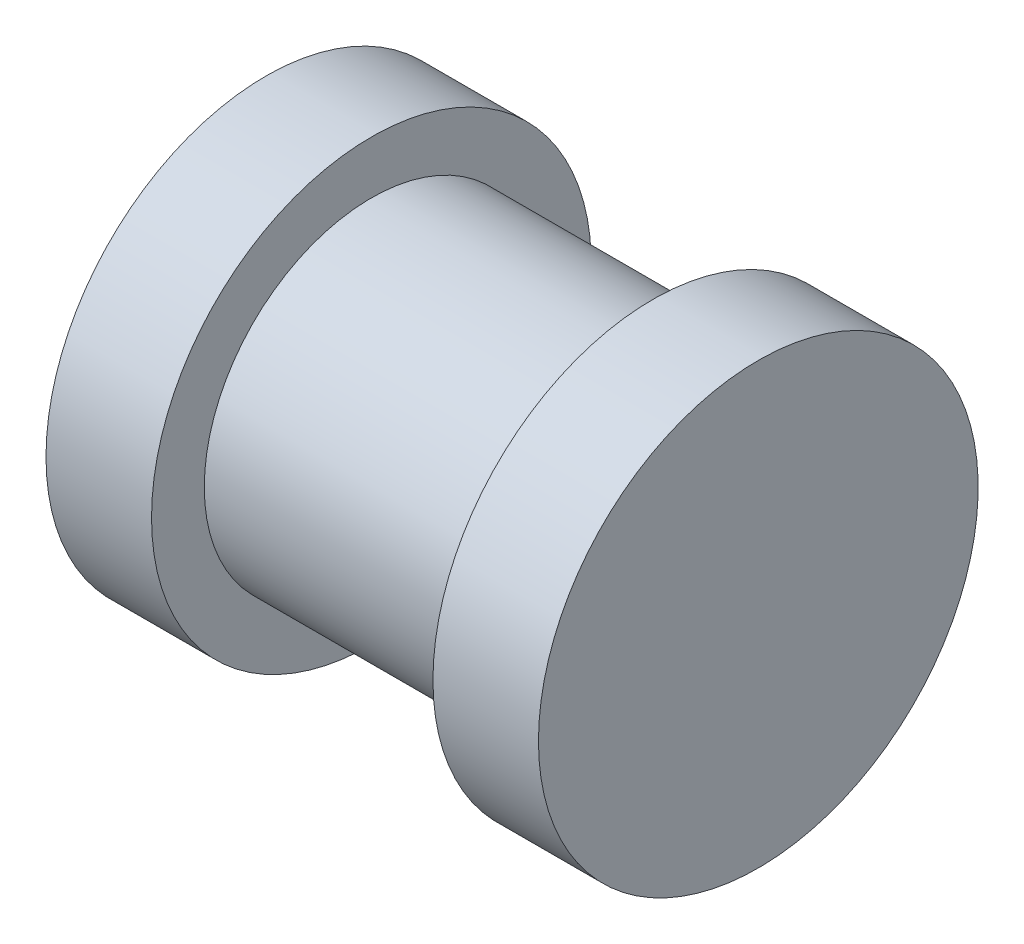
ISO-10303-21;
HEADER;
FILE_DESCRIPTION(('STEP AP214'),'2;1');
FILE_NAME('part.step','',(''),(''),'','','');
FILE_SCHEMA(('AUTOMOTIVE_DESIGN { 1 0 10303 214 1 1 1 1 }'));
ENDSEC;
DATA;
#1=APPLICATION_CONTEXT('core data for automotive mechanical design processes');
#2=APPLICATION_PROTOCOL_DEFINITION('international standard','automotive_design',2000,#1);
#3=PRODUCT_CONTEXT('',#1,'mechanical');
#4=PRODUCT('Part','Part','',(#3));
#5=PRODUCT_RELATED_PRODUCT_CATEGORY('part','',(#4));
#6=PRODUCT_DEFINITION_FORMATION('','',#4);
#7=PRODUCT_DEFINITION_CONTEXT('part definition',#1,'design');
#8=PRODUCT_DEFINITION('design','',#6,#7);
#9=PRODUCT_DEFINITION_SHAPE('','',#8);
#10=(LENGTH_UNIT() NAMED_UNIT(*) SI_UNIT(.MILLI.,.METRE.));
#11=(NAMED_UNIT(*) PLANE_ANGLE_UNIT() SI_UNIT($,.RADIAN.));
#12=(NAMED_UNIT(*) SI_UNIT($,.STERADIAN.) SOLID_ANGLE_UNIT());
#13=UNCERTAINTY_MEASURE_WITH_UNIT(LENGTH_MEASURE(1.E-05),#10,'distance_accuracy_value','');
#14=(GEOMETRIC_REPRESENTATION_CONTEXT(3) GLOBAL_UNCERTAINTY_ASSIGNED_CONTEXT((#13)) GLOBAL_UNIT_ASSIGNED_CONTEXT((#10,
#11,#12)) REPRESENTATION_CONTEXT('',''));
#15=CARTESIAN_POINT('',(0.,0.,0.));
#16=DIRECTION('',(0.,0.,1.));
#17=DIRECTION('',(1.,0.,0.));
#18=AXIS2_PLACEMENT_3D('',#15,#16,#17);
#19=CARTESIAN_POINT('',(14.224,0.,0.));
#20=DIRECTION('',(-1.,0.,0.));
#21=DIRECTION('',(0.,0.,1.));
#22=AXIS2_PLACEMENT_3D('',#19,#20,#21);
#23=PLANE('',#22);
#24=CARTESIAN_POINT('',(14.224,0.,0.));
#25=DIRECTION('',(-1.,0.,0.));
#26=DIRECTION('',(0.,0.,1.));
#27=AXIS2_PLACEMENT_3D('',#24,#25,#26);
#28=CIRCLE('',#27,6.35);
#29=CARTESIAN_POINT('',(14.224,0.,6.35));
#30=VERTEX_POINT('',#29);
#31=EDGE_CURVE('E10',#30,#30,#28,.T.);
#32=ORIENTED_EDGE('',*,*,#31,.F.);
#33=EDGE_LOOP('',(#32));
#34=FACE_BOUND('',#33,.T.);
#35=ADVANCED_FACE('F31',(#34),#23,.F.);
#36=CARTESIAN_POINT('',(0.,0.,0.));
#37=DIRECTION('',(-1.,0.,0.));
#38=DIRECTION('',(0.,0.,1.));
#39=AXIS2_PLACEMENT_3D('',#36,#37,#38);
#40=CYLINDRICAL_SURFACE('',#39,6.35);
#41=CARTESIAN_POINT('',(11.176,0.,0.));
#42=DIRECTION('',(-1.,0.,0.));
#43=DIRECTION('',(0.,0.,1.));
#44=AXIS2_PLACEMENT_3D('',#41,#42,#43);
#45=CIRCLE('',#44,6.35);
#46=CARTESIAN_POINT('',(11.176,0.,6.35));
#47=VERTEX_POINT('',#46);
#48=EDGE_CURVE('E37',#47,#47,#45,.T.);
#49=ORIENTED_EDGE('',*,*,#48,.F.);
#50=EDGE_LOOP('',(#49));
#51=FACE_BOUND('',#50,.T.);
#52=ORIENTED_EDGE('',*,*,#31,.T.);
#53=EDGE_LOOP('',(#52));
#54=FACE_BOUND('',#53,.T.);
#55=ADVANCED_FACE('F79',(#51,#54),#40,.T.);
#56=CARTESIAN_POINT('',(11.176,6.35,0.));
#57=DIRECTION('',(1.,0.,0.));
#58=DIRECTION('',(0.,0.,-1.));
#59=AXIS2_PLACEMENT_3D('',#56,#57,#58);
#60=PLANE('',#59);
#61=CARTESIAN_POINT('',(11.176,0.,0.));
#62=DIRECTION('',(-1.,0.,0.));
#63=DIRECTION('',(0.,0.,1.));
#64=AXIS2_PLACEMENT_3D('',#61,#62,#63);
#65=CIRCLE('',#64,4.826);
#66=CARTESIAN_POINT('',(11.176,0.,4.826));
#67=VERTEX_POINT('',#66);
#68=EDGE_CURVE('E41',#67,#67,#65,.T.);
#69=ORIENTED_EDGE('',*,*,#68,.F.);
#70=EDGE_LOOP('',(#69));
#71=FACE_BOUND('',#70,.T.);
#72=ORIENTED_EDGE('',*,*,#48,.T.);
#73=EDGE_LOOP('',(#72));
#74=FACE_BOUND('',#73,.T.);
#75=ADVANCED_FACE('F74',(#71,#74),#60,.F.);
#76=CARTESIAN_POINT('',(0.,0.,0.));
#77=DIRECTION('',(-1.,0.,0.));
#78=DIRECTION('',(0.,0.,1.));
#79=AXIS2_PLACEMENT_3D('',#76,#77,#78);
#80=CYLINDRICAL_SURFACE('',#79,4.826);
#81=CARTESIAN_POINT('',(3.048,0.,0.));
#82=DIRECTION('',(-1.,0.,0.));
#83=DIRECTION('',(0.,0.,1.));
#84=AXIS2_PLACEMENT_3D('',#81,#82,#83);
#85=CIRCLE('',#84,4.826);
#86=CARTESIAN_POINT('',(3.048,0.,4.826));
#87=VERTEX_POINT('',#86);
#88=EDGE_CURVE('E45',#87,#87,#85,.T.);
#89=ORIENTED_EDGE('',*,*,#88,.F.);
#90=EDGE_LOOP('',(#89));
#91=FACE_BOUND('',#90,.T.);
#92=ORIENTED_EDGE('',*,*,#68,.T.);
#93=EDGE_LOOP('',(#92));
#94=FACE_BOUND('',#93,.T.);
#95=ADVANCED_FACE('F68',(#91,#94),#80,.T.);
#96=CARTESIAN_POINT('',(3.048,4.826,0.));
#97=DIRECTION('',(-1.,0.,0.));
#98=DIRECTION('',(0.,0.,1.));
#99=AXIS2_PLACEMENT_3D('',#96,#97,#98);
#100=PLANE('',#99);
#101=CARTESIAN_POINT('',(3.048,0.,0.));
#102=DIRECTION('',(-1.,0.,0.));
#103=DIRECTION('',(0.,0.,1.));
#104=AXIS2_PLACEMENT_3D('',#101,#102,#103);
#105=CIRCLE('',#104,6.35);
#106=CARTESIAN_POINT('',(3.048,0.,6.35));
#107=VERTEX_POINT('',#106);
#108=EDGE_CURVE('E50',#107,#107,#105,.T.);
#109=ORIENTED_EDGE('',*,*,#108,.F.);
#110=EDGE_LOOP('',(#109));
#111=FACE_BOUND('',#110,.T.);
#112=ORIENTED_EDGE('',*,*,#88,.T.);
#113=EDGE_LOOP('',(#112));
#114=FACE_BOUND('',#113,.T.);
#115=ADVANCED_FACE('F62',(#111,#114),#100,.F.);
#116=CARTESIAN_POINT('',(0.,0.,0.));
#117=DIRECTION('',(-1.,0.,0.));
#118=DIRECTION('',(0.,0.,1.));
#119=AXIS2_PLACEMENT_3D('',#116,#117,#118);
#120=CYLINDRICAL_SURFACE('',#119,6.35);
#121=CARTESIAN_POINT('',(0.,0.,0.));
#122=DIRECTION('',(-1.,0.,0.));
#123=DIRECTION('',(0.,0.,1.));
#124=AXIS2_PLACEMENT_3D('',#121,#122,#123);
#125=CIRCLE('',#124,6.35);
#126=CARTESIAN_POINT('',(0.,0.,6.35));
#127=VERTEX_POINT('',#126);
#128=EDGE_CURVE('E53',#127,#127,#125,.T.);
#129=ORIENTED_EDGE('',*,*,#128,.F.);
#130=EDGE_LOOP('',(#129));
#131=FACE_BOUND('',#130,.T.);
#132=ORIENTED_EDGE('',*,*,#108,.T.);
#133=EDGE_LOOP('',(#132));
#134=FACE_BOUND('',#133,.T.);
#135=ADVANCED_FACE('F59',(#131,#134),#120,.T.);
#136=CARTESIAN_POINT('',(0.,6.35,0.));
#137=DIRECTION('',(1.,0.,0.));
#138=DIRECTION('',(0.,0.,-1.));
#139=AXIS2_PLACEMENT_3D('',#136,#137,#138);
#140=PLANE('',#139);
#141=ORIENTED_EDGE('',*,*,#128,.T.);
#142=EDGE_LOOP('',(#141));
#143=FACE_BOUND('',#142,.T.);
#144=ADVANCED_FACE('F57',(#143),#140,.F.);
#145=CLOSED_SHELL('',(#35,#55,#75,#95,#115,#135,#144));
#146=MANIFOLD_SOLID_BREP('B2',#145);
#147=ADVANCED_BREP_SHAPE_REPRESENTATION('',(#18,#146),#14);
#148=SHAPE_DEFINITION_REPRESENTATION(#9,#147);
ENDSEC;
END-ISO-10303-21;
